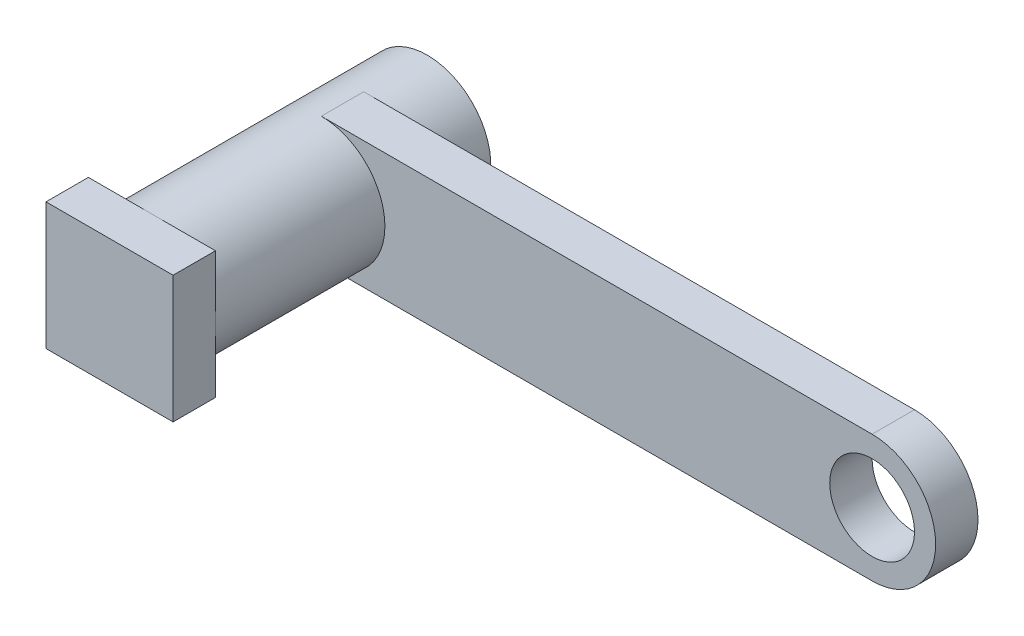
ISO-10303-21;
HEADER;
FILE_DESCRIPTION(('STEP AP214'),'2;1');
FILE_NAME('part.step','',(''),(''),'','','');
FILE_SCHEMA(('AUTOMOTIVE_DESIGN { 1 0 10303 214 1 1 1 1 }'));
ENDSEC;
DATA;
#1=APPLICATION_CONTEXT('core data for automotive mechanical design processes');
#2=APPLICATION_PROTOCOL_DEFINITION('international standard','automotive_design',2000,#1);
#3=PRODUCT_CONTEXT('',#1,'mechanical');
#4=PRODUCT('Part','Part','',(#3));
#5=PRODUCT_RELATED_PRODUCT_CATEGORY('part','',(#4));
#6=PRODUCT_DEFINITION_FORMATION('','',#4);
#7=PRODUCT_DEFINITION_CONTEXT('part definition',#1,'design');
#8=PRODUCT_DEFINITION('design','',#6,#7);
#9=PRODUCT_DEFINITION_SHAPE('','',#8);
#10=(LENGTH_UNIT() NAMED_UNIT(*) SI_UNIT(.MILLI.,.METRE.));
#11=(NAMED_UNIT(*) PLANE_ANGLE_UNIT() SI_UNIT($,.RADIAN.));
#12=(NAMED_UNIT(*) SI_UNIT($,.STERADIAN.) SOLID_ANGLE_UNIT());
#13=UNCERTAINTY_MEASURE_WITH_UNIT(LENGTH_MEASURE(1.E-05),#10,'distance_accuracy_value','');
#14=(GEOMETRIC_REPRESENTATION_CONTEXT(3) GLOBAL_UNCERTAINTY_ASSIGNED_CONTEXT((#13)) GLOBAL_UNIT_ASSIGNED_CONTEXT((#10,
#11,#12)) REPRESENTATION_CONTEXT('',''));
#15=CARTESIAN_POINT('',(0.,0.,0.));
#16=DIRECTION('',(0.,0.,1.));
#17=DIRECTION('',(1.,0.,0.));
#18=AXIS2_PLACEMENT_3D('',#15,#16,#17);
#19=CARTESIAN_POINT('',(-44.2925132380591,7.49999999999998,0.));
#20=DIRECTION('',(0.,0.,1.));
#21=DIRECTION('',(1.,0.,0.));
#22=AXIS2_PLACEMENT_3D('',#19,#20,#21);
#23=PLANE('',#22);
#24=CARTESIAN_POINT('',(85.7074867619409,7.5,0.));
#25=DIRECTION('',(0.,0.,1.));
#26=DIRECTION('',(-1.,0.,0.));
#27=AXIS2_PLACEMENT_3D('',#24,#25,#26);
#28=CIRCLE('',#27,9.99999999999999);
#29=CARTESIAN_POINT('',(75.7074867619409,7.5,0.));
#30=VERTEX_POINT('',#29);
#31=EDGE_CURVE('E166',#30,#30,#28,.T.);
#32=ORIENTED_EDGE('',*,*,#31,.T.);
#33=EDGE_LOOP('',(#32));
#34=FACE_BOUND('',#33,.T.);
#35=CARTESIAN_POINT('',(-44.2925132380591,7.49999999999998,0.));
#36=DIRECTION('',(0.,0.,-1.));
#37=DIRECTION('',(-1.,0.,0.));
#38=AXIS2_PLACEMENT_3D('',#35,#36,#37);
#39=CIRCLE('',#38,15.);
#40=CARTESIAN_POINT('',(-44.2925132380591,22.5,0.));
#41=VERTEX_POINT('',#40);
#42=CARTESIAN_POINT('',(-44.2925132380591,-7.50000000000001,0.));
#43=VERTEX_POINT('',#42);
#44=EDGE_CURVE('E116',#41,#43,#39,.T.);
#45=ORIENTED_EDGE('',*,*,#44,.F.);
#46=DIRECTION('',(-1.,0.,0.));
#47=VECTOR('',#46,1.);
#48=CARTESIAN_POINT('',(-44.2925132380591,22.5,0.));
#49=LINE('',#48,#47);
#50=CARTESIAN_POINT('',(85.7074867619409,22.5,0.));
#51=VERTEX_POINT('',#50);
#52=EDGE_CURVE('E119',#51,#41,#49,.T.);
#53=ORIENTED_EDGE('',*,*,#52,.F.);
#54=CARTESIAN_POINT('',(85.7074867619409,7.5,0.));
#55=DIRECTION('',(0.,0.,1.));
#56=DIRECTION('',(-1.,0.,0.));
#57=AXIS2_PLACEMENT_3D('',#54,#55,#56);
#58=CIRCLE('',#57,15.);
#59=CARTESIAN_POINT('',(85.7074867619409,-7.5,0.));
#60=VERTEX_POINT('',#59);
#61=EDGE_CURVE('E139',#60,#51,#58,.T.);
#62=ORIENTED_EDGE('',*,*,#61,.F.);
#63=DIRECTION('',(1.,0.,0.));
#64=VECTOR('',#63,1.);
#65=CARTESIAN_POINT('',(-44.2925132380591,-7.50000000000001,0.));
#66=LINE('',#65,#64);
#67=EDGE_CURVE('E120',#43,#60,#66,.T.);
#68=ORIENTED_EDGE('',*,*,#67,.F.);
#69=EDGE_LOOP('',(#45,#53,#62,#68));
#70=FACE_BOUND('',#69,.T.);
#71=ADVANCED_FACE('F39',(#34,#70),#23,.F.);
#72=CARTESIAN_POINT('',(-44.2925132380591,7.49999999999998,10.));
#73=DIRECTION('',(0.,0.,1.));
#74=DIRECTION('',(1.,0.,0.));
#75=AXIS2_PLACEMENT_3D('',#72,#73,#74);
#76=PLANE('',#75);
#77=CARTESIAN_POINT('',(-44.2925132380591,7.49999999999998,10.));
#78=DIRECTION('',(0.,0.,1.));
#79=DIRECTION('',(1.,0.,0.));
#80=AXIS2_PLACEMENT_3D('',#77,#78,#79);
#81=CIRCLE('',#80,15.);
#82=CARTESIAN_POINT('',(-44.2925132380591,-7.50000000000001,10.));
#83=VERTEX_POINT('',#82);
#84=CARTESIAN_POINT('',(-44.2925132380591,22.5,10.));
#85=VERTEX_POINT('',#84);
#86=EDGE_CURVE('E11',#83,#85,#81,.T.);
#87=ORIENTED_EDGE('',*,*,#86,.F.);
#88=DIRECTION('',(1.,0.,0.));
#89=VECTOR('',#88,1.);
#90=CARTESIAN_POINT('',(-44.2925132380591,-7.50000000000001,10.));
#91=LINE('',#90,#89);
#92=CARTESIAN_POINT('',(85.7074867619409,-7.5,10.));
#93=VERTEX_POINT('',#92);
#94=EDGE_CURVE('E138',#83,#93,#91,.T.);
#95=ORIENTED_EDGE('',*,*,#94,.T.);
#96=CARTESIAN_POINT('',(85.7074867619409,7.5,10.));
#97=DIRECTION('',(0.,0.,1.));
#98=DIRECTION('',(-1.,0.,0.));
#99=AXIS2_PLACEMENT_3D('',#96,#97,#98);
#100=CIRCLE('',#99,15.);
#101=CARTESIAN_POINT('',(85.7074867619409,22.5,10.));
#102=VERTEX_POINT('',#101);
#103=EDGE_CURVE('E148',#93,#102,#100,.T.);
#104=ORIENTED_EDGE('',*,*,#103,.T.);
#105=DIRECTION('',(-1.,0.,0.));
#106=VECTOR('',#105,1.);
#107=CARTESIAN_POINT('',(-44.2925132380591,22.5,10.));
#108=LINE('',#107,#106);
#109=EDGE_CURVE('E142',#102,#85,#108,.T.);
#110=ORIENTED_EDGE('',*,*,#109,.T.);
#111=EDGE_LOOP('',(#87,#95,#104,#110));
#112=FACE_BOUND('',#111,.T.);
#113=CARTESIAN_POINT('',(85.7074867619409,7.5,10.));
#114=DIRECTION('',(0.,0.,1.));
#115=DIRECTION('',(-1.,0.,0.));
#116=AXIS2_PLACEMENT_3D('',#113,#114,#115);
#117=CIRCLE('',#116,9.99999999999999);
#118=CARTESIAN_POINT('',(75.7074867619409,7.5,10.));
#119=VERTEX_POINT('',#118);
#120=EDGE_CURVE('E170',#119,#119,#117,.T.);
#121=ORIENTED_EDGE('',*,*,#120,.F.);
#122=EDGE_LOOP('',(#121));
#123=FACE_BOUND('',#122,.T.);
#124=ADVANCED_FACE('F173',(#112,#123),#76,.T.);
#125=CARTESIAN_POINT('',(-44.2925132380591,7.49999999999998,10.));
#126=DIRECTION('',(0.,0.,-1.));
#127=DIRECTION('',(-1.,0.,0.));
#128=AXIS2_PLACEMENT_3D('',#125,#126,#127);
#129=CYLINDRICAL_SURFACE('',#128,15.);
#130=DIRECTION('',(0.,0.,-1.));
#131=VECTOR('',#130,1.);
#132=CARTESIAN_POINT('',(-44.2925132380591,22.5,10.));
#133=LINE('',#132,#131);
#134=EDGE_CURVE('E133',#85,#41,#133,.T.);
#135=ORIENTED_EDGE('',*,*,#134,.T.);
#136=ORIENTED_EDGE('',*,*,#44,.T.);
#137=DIRECTION('',(0.,0.,-1.));
#138=VECTOR('',#137,1.);
#139=CARTESIAN_POINT('',(-44.2925132380591,-7.50000000000001,10.));
#140=LINE('',#139,#138);
#141=EDGE_CURVE('E43',#83,#43,#140,.T.);
#142=ORIENTED_EDGE('',*,*,#141,.F.);
#143=ORIENTED_EDGE('',*,*,#86,.T.);
#144=EDGE_LOOP('',(#135,#136,#142,#143));
#145=FACE_BOUND('',#144,.T.);
#146=CARTESIAN_POINT('',(-44.2925132380591,7.49999999999998,50.));
#147=DIRECTION('',(0.,0.,1.));
#148=DIRECTION('',(1.,0.,0.));
#149=AXIS2_PLACEMENT_3D('',#146,#147,#148);
#150=CIRCLE('',#149,15.);
#151=CARTESIAN_POINT('',(-29.2925132380591,7.49999999999999,50.));
#152=VERTEX_POINT('',#151);
#153=CARTESIAN_POINT('',(-44.2925132380591,22.5,50.));
#154=VERTEX_POINT('',#153);
#155=EDGE_CURVE('E183',#152,#154,#150,.T.);
#156=ORIENTED_EDGE('',*,*,#155,.F.);
#157=CARTESIAN_POINT('',(-44.2925132380591,-7.50000000000001,50.));
#158=VERTEX_POINT('',#157);
#159=EDGE_CURVE('E56',#158,#152,#150,.T.);
#160=ORIENTED_EDGE('',*,*,#159,.F.);
#161=CARTESIAN_POINT('',(-59.2925132380591,7.49999999999998,50.));
#162=VERTEX_POINT('',#161);
#163=EDGE_CURVE('E60',#162,#158,#150,.T.);
#164=ORIENTED_EDGE('',*,*,#163,.F.);
#165=EDGE_CURVE('E188',#154,#162,#150,.T.);
#166=ORIENTED_EDGE('',*,*,#165,.F.);
#167=EDGE_LOOP('',(#156,#160,#164,#166));
#168=FACE_BOUND('',#167,.T.);
#169=CARTESIAN_POINT('',(-44.2925132380591,7.49999999999998,-15.));
#170=DIRECTION('',(0.,0.,-1.));
#171=DIRECTION('',(-1.,0.,0.));
#172=AXIS2_PLACEMENT_3D('',#169,#170,#171);
#173=CIRCLE('',#172,15.);
#174=CARTESIAN_POINT('',(-59.2925132380591,7.49999999999998,-15.));
#175=VERTEX_POINT('',#174);
#176=EDGE_CURVE('E126',#175,#175,#173,.T.);
#177=ORIENTED_EDGE('',*,*,#176,.F.);
#178=EDGE_LOOP('',(#177));
#179=FACE_BOUND('',#178,.T.);
#180=ADVANCED_FACE('F41',(#145,#168,#179),#129,.T.);
#181=CARTESIAN_POINT('',(-44.2925132380591,-7.50000000000001,10.));
#182=DIRECTION('',(0.,1.,0.));
#183=DIRECTION('',(-1.,0.,0.));
#184=AXIS2_PLACEMENT_3D('',#181,#182,#183);
#185=PLANE('',#184);
#186=ORIENTED_EDGE('',*,*,#67,.T.);
#187=DIRECTION('',(0.,0.,-1.));
#188=VECTOR('',#187,1.);
#189=CARTESIAN_POINT('',(85.7074867619409,-7.5,10.));
#190=LINE('',#189,#188);
#191=EDGE_CURVE('E146',#93,#60,#190,.T.);
#192=ORIENTED_EDGE('',*,*,#191,.F.);
#193=ORIENTED_EDGE('',*,*,#94,.F.);
#194=ORIENTED_EDGE('',*,*,#141,.T.);
#195=EDGE_LOOP('',(#186,#192,#193,#194));
#196=FACE_BOUND('',#195,.T.);
#197=ADVANCED_FACE('F159',(#196),#185,.F.);
#198=CARTESIAN_POINT('',(85.7074867619409,7.5,10.));
#199=DIRECTION('',(0.,0.,-1.));
#200=DIRECTION('',(-1.,0.,0.));
#201=AXIS2_PLACEMENT_3D('',#198,#199,#200);
#202=CYLINDRICAL_SURFACE('',#201,15.);
#203=ORIENTED_EDGE('',*,*,#61,.T.);
#204=DIRECTION('',(0.,0.,-1.));
#205=VECTOR('',#204,1.);
#206=CARTESIAN_POINT('',(85.7074867619409,22.5,10.));
#207=LINE('',#206,#205);
#208=EDGE_CURVE('E136',#102,#51,#207,.T.);
#209=ORIENTED_EDGE('',*,*,#208,.F.);
#210=ORIENTED_EDGE('',*,*,#103,.F.);
#211=ORIENTED_EDGE('',*,*,#191,.T.);
#212=EDGE_LOOP('',(#203,#209,#210,#211));
#213=FACE_BOUND('',#212,.T.);
#214=ADVANCED_FACE('F172',(#213),#202,.T.);
#215=CARTESIAN_POINT('',(-44.2925132380591,22.5,10.));
#216=DIRECTION('',(0.,-1.,0.));
#217=DIRECTION('',(1.,0.,0.));
#218=AXIS2_PLACEMENT_3D('',#215,#216,#217);
#219=PLANE('',#218);
#220=ORIENTED_EDGE('',*,*,#52,.T.);
#221=ORIENTED_EDGE('',*,*,#134,.F.);
#222=ORIENTED_EDGE('',*,*,#109,.F.);
#223=ORIENTED_EDGE('',*,*,#208,.T.);
#224=EDGE_LOOP('',(#220,#221,#222,#223));
#225=FACE_BOUND('',#224,.T.);
#226=ADVANCED_FACE('F131',(#225),#219,.F.);
#227=CARTESIAN_POINT('',(85.7074867619409,7.5,10.));
#228=DIRECTION('',(0.,0.,-1.));
#229=DIRECTION('',(-1.,0.,0.));
#230=AXIS2_PLACEMENT_3D('',#227,#228,#229);
#231=CYLINDRICAL_SURFACE('',#230,9.99999999999999);
#232=ORIENTED_EDGE('',*,*,#120,.T.);
#233=EDGE_LOOP('',(#232));
#234=FACE_BOUND('',#233,.T.);
#235=ORIENTED_EDGE('',*,*,#31,.F.);
#236=EDGE_LOOP('',(#235));
#237=FACE_BOUND('',#236,.T.);
#238=ADVANCED_FACE('F277',(#234,#237),#231,.F.);
#239=CARTESIAN_POINT('',(0.,0.,50.));
#240=DIRECTION('',(0.,0.,1.));
#241=DIRECTION('',(1.,0.,0.));
#242=AXIS2_PLACEMENT_3D('',#239,#240,#241);
#243=PLANE('',#242);
#244=DIRECTION('',(0.,1.,0.));
#245=VECTOR('',#244,1.);
#246=CARTESIAN_POINT('',(-29.2925132380591,22.5,50.));
#247=LINE('',#246,#245);
#248=CARTESIAN_POINT('',(-29.2925132380591,22.5,50.));
#249=VERTEX_POINT('',#248);
#250=EDGE_CURVE('E220',#152,#249,#247,.T.);
#251=ORIENTED_EDGE('',*,*,#250,.F.);
#252=ORIENTED_EDGE('',*,*,#155,.T.);
#253=DIRECTION('',(-1.,0.,0.));
#254=VECTOR('',#253,1.);
#255=CARTESIAN_POINT('',(-59.2925132380591,22.5,50.));
#256=LINE('',#255,#254);
#257=EDGE_CURVE('E210',#249,#154,#256,.T.);
#258=ORIENTED_EDGE('',*,*,#257,.F.);
#259=EDGE_LOOP('',(#251,#252,#258));
#260=FACE_BOUND('',#259,.T.);
#261=ADVANCED_FACE('F263',(#260),#243,.F.);
#262=CARTESIAN_POINT('',(-59.2925132380591,22.5,50.));
#263=VERTEX_POINT('',#262);
#264=EDGE_CURVE('E215',#154,#263,#256,.T.);
#265=ORIENTED_EDGE('',*,*,#264,.F.);
#266=ORIENTED_EDGE('',*,*,#165,.T.);
#267=DIRECTION('',(0.,-1.,0.));
#268=VECTOR('',#267,1.);
#269=CARTESIAN_POINT('',(-59.2925132380591,22.5,50.));
#270=LINE('',#269,#268);
#271=EDGE_CURVE('E226',#263,#162,#270,.T.);
#272=ORIENTED_EDGE('',*,*,#271,.F.);
#273=EDGE_LOOP('',(#265,#266,#272));
#274=FACE_BOUND('',#273,.T.);
#275=ADVANCED_FACE('F312',(#274),#243,.F.);
#276=CARTESIAN_POINT('',(-59.2925132380591,-7.50000000000001,50.));
#277=VERTEX_POINT('',#276);
#278=EDGE_CURVE('E230',#162,#277,#270,.T.);
#279=ORIENTED_EDGE('',*,*,#278,.F.);
#280=ORIENTED_EDGE('',*,*,#163,.T.);
#281=DIRECTION('',(1.,0.,0.));
#282=VECTOR('',#281,1.);
#283=CARTESIAN_POINT('',(-59.2925132380591,-7.50000000000001,50.));
#284=LINE('',#283,#282);
#285=EDGE_CURVE('E221',#277,#158,#284,.T.);
#286=ORIENTED_EDGE('',*,*,#285,.F.);
#287=EDGE_LOOP('',(#279,#280,#286));
#288=FACE_BOUND('',#287,.T.);
#289=ADVANCED_FACE('F321',(#288),#243,.F.);
#290=CARTESIAN_POINT('',(-29.2925132380591,-7.50000000000001,50.));
#291=VERTEX_POINT('',#290);
#292=EDGE_CURVE('E225',#158,#291,#284,.T.);
#293=ORIENTED_EDGE('',*,*,#292,.F.);
#294=ORIENTED_EDGE('',*,*,#159,.T.);
#295=EDGE_CURVE('E216',#291,#152,#247,.T.);
#296=ORIENTED_EDGE('',*,*,#295,.F.);
#297=EDGE_LOOP('',(#293,#294,#296));
#298=FACE_BOUND('',#297,.T.);
#299=ADVANCED_FACE('F264',(#298),#243,.F.);
#300=CARTESIAN_POINT('',(-59.2925132380591,22.5,60.));
#301=DIRECTION('',(1.,0.,0.));
#302=DIRECTION('',(0.,1.,0.));
#303=AXIS2_PLACEMENT_3D('',#300,#301,#302);
#304=PLANE('',#303);
#305=ORIENTED_EDGE('',*,*,#271,.T.);
#306=ORIENTED_EDGE('',*,*,#278,.T.);
#307=DIRECTION('',(0.,0.,-1.));
#308=VECTOR('',#307,1.);
#309=CARTESIAN_POINT('',(-59.2925132380591,-7.50000000000001,60.));
#310=LINE('',#309,#308);
#311=CARTESIAN_POINT('',(-59.2925132380591,-7.50000000000001,60.));
#312=VERTEX_POINT('',#311);
#313=EDGE_CURVE('E193',#312,#277,#310,.T.);
#314=ORIENTED_EDGE('',*,*,#313,.F.);
#315=DIRECTION('',(0.,-1.,0.));
#316=VECTOR('',#315,1.);
#317=CARTESIAN_POINT('',(-59.2925132380591,22.5,60.));
#318=LINE('',#317,#316);
#319=CARTESIAN_POINT('',(-59.2925132380591,22.5,60.));
#320=VERTEX_POINT('',#319);
#321=EDGE_CURVE('E214',#320,#312,#318,.T.);
#322=ORIENTED_EDGE('',*,*,#321,.F.);
#323=DIRECTION('',(0.,0.,-1.));
#324=VECTOR('',#323,1.);
#325=CARTESIAN_POINT('',(-59.2925132380591,22.5,60.));
#326=LINE('',#325,#324);
#327=EDGE_CURVE('E205',#320,#263,#326,.T.);
#328=ORIENTED_EDGE('',*,*,#327,.T.);
#329=EDGE_LOOP('',(#305,#306,#314,#322,#328));
#330=FACE_BOUND('',#329,.T.);
#331=ADVANCED_FACE('F338',(#330),#304,.F.);
#332=CARTESIAN_POINT('',(-59.2925132380591,-7.50000000000001,60.));
#333=DIRECTION('',(0.,1.,0.));
#334=DIRECTION('',(0.,0.,1.));
#335=AXIS2_PLACEMENT_3D('',#332,#333,#334);
#336=PLANE('',#335);
#337=ORIENTED_EDGE('',*,*,#285,.T.);
#338=ORIENTED_EDGE('',*,*,#292,.T.);
#339=DIRECTION('',(0.,0.,-1.));
#340=VECTOR('',#339,1.);
#341=CARTESIAN_POINT('',(-29.2925132380591,-7.50000000000001,60.));
#342=LINE('',#341,#340);
#343=CARTESIAN_POINT('',(-29.2925132380591,-7.50000000000001,60.));
#344=VERTEX_POINT('',#343);
#345=EDGE_CURVE('E197',#344,#291,#342,.T.);
#346=ORIENTED_EDGE('',*,*,#345,.F.);
#347=DIRECTION('',(1.,0.,0.));
#348=VECTOR('',#347,1.);
#349=CARTESIAN_POINT('',(-59.2925132380591,-7.50000000000001,60.));
#350=LINE('',#349,#348);
#351=EDGE_CURVE('E236',#312,#344,#350,.T.);
#352=ORIENTED_EDGE('',*,*,#351,.F.);
#353=ORIENTED_EDGE('',*,*,#313,.T.);
#354=EDGE_LOOP('',(#337,#338,#346,#352,#353));
#355=FACE_BOUND('',#354,.T.);
#356=ADVANCED_FACE('F347',(#355),#336,.F.);
#357=CARTESIAN_POINT('',(-29.2925132380591,22.5,60.));
#358=DIRECTION('',(-1.,0.,0.));
#359=DIRECTION('',(0.,-1.,0.));
#360=AXIS2_PLACEMENT_3D('',#357,#358,#359);
#361=PLANE('',#360);
#362=ORIENTED_EDGE('',*,*,#295,.T.);
#363=ORIENTED_EDGE('',*,*,#250,.T.);
#364=DIRECTION('',(0.,0.,-1.));
#365=VECTOR('',#364,1.);
#366=CARTESIAN_POINT('',(-29.2925132380591,22.5,60.));
#367=LINE('',#366,#365);
#368=CARTESIAN_POINT('',(-29.2925132380591,22.5,60.));
#369=VERTEX_POINT('',#368);
#370=EDGE_CURVE('E201',#369,#249,#367,.T.);
#371=ORIENTED_EDGE('',*,*,#370,.F.);
#372=DIRECTION('',(0.,1.,0.));
#373=VECTOR('',#372,1.);
#374=CARTESIAN_POINT('',(-29.2925132380591,22.5,60.));
#375=LINE('',#374,#373);
#376=EDGE_CURVE('E233',#344,#369,#375,.T.);
#377=ORIENTED_EDGE('',*,*,#376,.F.);
#378=ORIENTED_EDGE('',*,*,#345,.T.);
#379=EDGE_LOOP('',(#362,#363,#371,#377,#378));
#380=FACE_BOUND('',#379,.T.);
#381=ADVANCED_FACE('F357',(#380),#361,.F.);
#382=CARTESIAN_POINT('',(-59.2925132380591,22.5,60.));
#383=DIRECTION('',(0.,-1.,0.));
#384=DIRECTION('',(0.,0.,-1.));
#385=AXIS2_PLACEMENT_3D('',#382,#383,#384);
#386=PLANE('',#385);
#387=ORIENTED_EDGE('',*,*,#257,.T.);
#388=ORIENTED_EDGE('',*,*,#264,.T.);
#389=ORIENTED_EDGE('',*,*,#327,.F.);
#390=DIRECTION('',(-1.,0.,0.));
#391=VECTOR('',#390,1.);
#392=CARTESIAN_POINT('',(-59.2925132380591,22.5,60.));
#393=LINE('',#392,#391);
#394=EDGE_CURVE('E209',#369,#320,#393,.T.);
#395=ORIENTED_EDGE('',*,*,#394,.F.);
#396=ORIENTED_EDGE('',*,*,#370,.T.);
#397=EDGE_LOOP('',(#387,#388,#389,#395,#396));
#398=FACE_BOUND('',#397,.T.);
#399=ADVANCED_FACE('F265',(#398),#386,.F.);
#400=CARTESIAN_POINT('',(0.,0.,60.));
#401=DIRECTION('',(0.,0.,1.));
#402=DIRECTION('',(1.,0.,0.));
#403=AXIS2_PLACEMENT_3D('',#400,#401,#402);
#404=PLANE('',#403);
#405=ORIENTED_EDGE('',*,*,#321,.T.);
#406=ORIENTED_EDGE('',*,*,#351,.T.);
#407=ORIENTED_EDGE('',*,*,#376,.T.);
#408=ORIENTED_EDGE('',*,*,#394,.T.);
#409=EDGE_LOOP('',(#405,#406,#407,#408));
#410=FACE_BOUND('',#409,.T.);
#411=ADVANCED_FACE('F254',(#410),#404,.T.);
#412=CARTESIAN_POINT('',(-44.2925132380591,7.49999999999998,-15.));
#413=DIRECTION('',(0.,0.,-1.));
#414=DIRECTION('',(-1.,0.,0.));
#415=AXIS2_PLACEMENT_3D('',#412,#413,#414);
#416=PLANE('',#415);
#417=ORIENTED_EDGE('',*,*,#176,.T.);
#418=EDGE_LOOP('',(#417));
#419=FACE_BOUND('',#418,.T.);
#420=CARTESIAN_POINT('',(-44.2925132380591,7.49999999999998,-15.));
#421=DIRECTION('',(0.,0.,-1.));
#422=DIRECTION('',(-1.,0.,0.));
#423=AXIS2_PLACEMENT_3D('',#420,#421,#422);
#424=CIRCLE('',#423,10.);
#425=CARTESIAN_POINT('',(-54.2925132380591,7.49999999999998,-15.));
#426=VERTEX_POINT('',#425);
#427=EDGE_CURVE('E127',#426,#426,#424,.T.);
#428=ORIENTED_EDGE('',*,*,#427,.F.);
#429=EDGE_LOOP('',(#428));
#430=FACE_BOUND('',#429,.T.);
#431=ADVANCED_FACE('F251',(#419,#430),#416,.T.);
#432=CARTESIAN_POINT('',(-44.2925132380591,7.49999999999998,50.));
#433=DIRECTION('',(0.,0.,1.));
#434=DIRECTION('',(1.,0.,0.));
#435=AXIS2_PLACEMENT_3D('',#432,#433,#434);
#436=CIRCLE('',#435,10.);
#437=CARTESIAN_POINT('',(-34.2925132380591,7.49999999999998,50.));
#438=VERTEX_POINT('',#437);
#439=EDGE_CURVE('E189',#438,#438,#436,.T.);
#440=ORIENTED_EDGE('',*,*,#439,.F.);
#441=EDGE_LOOP('',(#440));
#442=FACE_BOUND('',#441,.T.);
#443=ADVANCED_FACE('F253',(#442),#243,.F.);
#444=CARTESIAN_POINT('',(-44.2925132380591,7.49999999999998,10.));
#445=DIRECTION('',(0.,0.,-1.));
#446=DIRECTION('',(-1.,0.,0.));
#447=AXIS2_PLACEMENT_3D('',#444,#445,#446);
#448=CYLINDRICAL_SURFACE('',#447,10.);
#449=ORIENTED_EDGE('',*,*,#439,.T.);
#450=EDGE_LOOP('',(#449));
#451=FACE_BOUND('',#450,.T.);
#452=ORIENTED_EDGE('',*,*,#427,.T.);
#453=EDGE_LOOP('',(#452));
#454=FACE_BOUND('',#453,.T.);
#455=ADVANCED_FACE('F249',(#451,#454),#448,.F.);
#456=CLOSED_SHELL('',(#71,#124,#180,#197,#214,#226,#238,#261,#275,#289,#299,#331,#356,#381,#399,
#411,#431,#443,#455));
#457=MANIFOLD_SOLID_BREP('B2',#456);
#458=ADVANCED_BREP_SHAPE_REPRESENTATION('',(#18,#457),#14);
#459=SHAPE_DEFINITION_REPRESENTATION(#9,#458);
ENDSEC;
END-ISO-10303-21;
